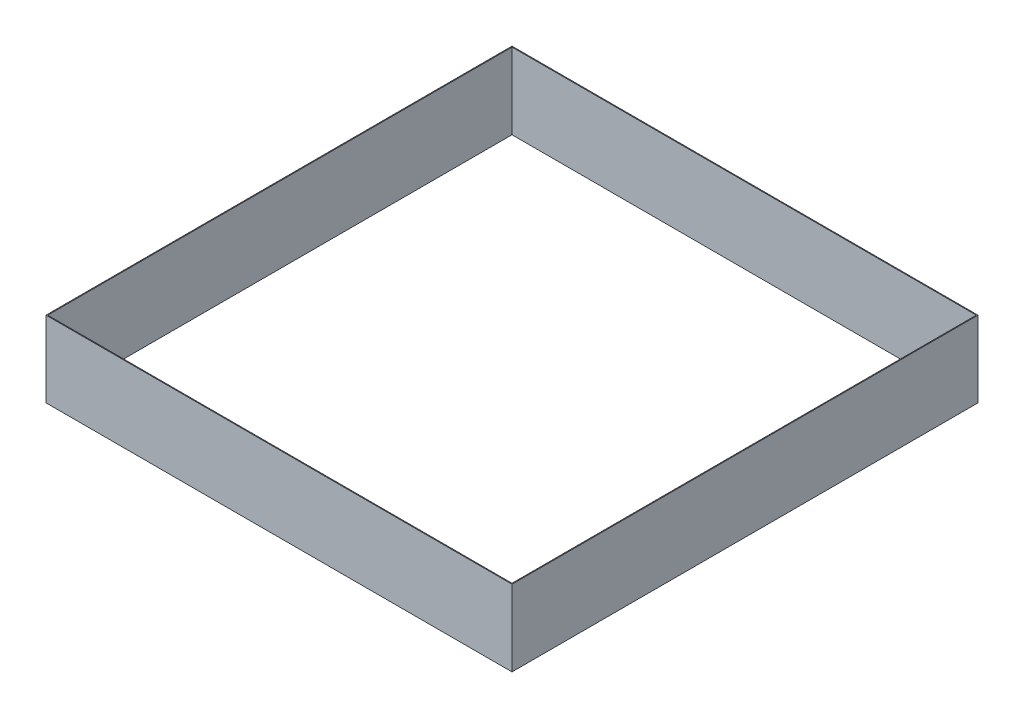
ISO-10303-21;
HEADER;
FILE_DESCRIPTION(('STEP AP214'),'2;1');
FILE_NAME('part.step','',(''),(''),'','','');
FILE_SCHEMA(('AUTOMOTIVE_DESIGN { 1 0 10303 214 1 1 1 1 }'));
ENDSEC;
DATA;
#1=APPLICATION_CONTEXT('core data for automotive mechanical design processes');
#2=APPLICATION_PROTOCOL_DEFINITION('international standard','automotive_design',2000,#1);
#3=PRODUCT_CONTEXT('',#1,'mechanical');
#4=PRODUCT('Part','Part','',(#3));
#5=PRODUCT_RELATED_PRODUCT_CATEGORY('part','',(#4));
#6=PRODUCT_DEFINITION_FORMATION('','',#4);
#7=PRODUCT_DEFINITION_CONTEXT('part definition',#1,'design');
#8=PRODUCT_DEFINITION('design','',#6,#7);
#9=PRODUCT_DEFINITION_SHAPE('','',#8);
#10=(LENGTH_UNIT() NAMED_UNIT(*) SI_UNIT(.MILLI.,.METRE.));
#11=(NAMED_UNIT(*) PLANE_ANGLE_UNIT() SI_UNIT($,.RADIAN.));
#12=(NAMED_UNIT(*) SI_UNIT($,.STERADIAN.) SOLID_ANGLE_UNIT());
#13=UNCERTAINTY_MEASURE_WITH_UNIT(LENGTH_MEASURE(1.E-05),#10,'distance_accuracy_value','');
#14=(GEOMETRIC_REPRESENTATION_CONTEXT(3) GLOBAL_UNCERTAINTY_ASSIGNED_CONTEXT((#13)) GLOBAL_UNIT_ASSIGNED_CONTEXT((#10,
#11,#12)) REPRESENTATION_CONTEXT('',''));
#15=CARTESIAN_POINT('',(0.,0.,0.));
#16=DIRECTION('',(0.,0.,1.));
#17=DIRECTION('',(1.,0.,0.));
#18=AXIS2_PLACEMENT_3D('',#15,#16,#17);
#19=CARTESIAN_POINT('',(0.,54.,0.));
#20=DIRECTION('',(0.,1.,0.));
#21=DIRECTION('',(0.,0.,1.));
#22=AXIS2_PLACEMENT_3D('',#19,#20,#21);
#23=PLANE('',#22);
#24=DIRECTION('',(-1.,0.,0.));
#25=VECTOR('',#24,1.);
#26=CARTESIAN_POINT('',(331.2,54.,0.));
#27=LINE('',#26,#25);
#28=CARTESIAN_POINT('',(331.2,54.,0.));
#29=VERTEX_POINT('',#28);
#30=CARTESIAN_POINT('',(0.,54.,0.));
#31=VERTEX_POINT('',#30);
#32=EDGE_CURVE('E153',#29,#31,#27,.T.);
#33=ORIENTED_EDGE('',*,*,#32,.T.);
#34=DIRECTION('',(0.,0.,1.));
#35=VECTOR('',#34,1.);
#36=CARTESIAN_POINT('',(0.,54.,0.));
#37=LINE('',#36,#35);
#38=CARTESIAN_POINT('',(0.,54.,331.2));
#39=VERTEX_POINT('',#38);
#40=EDGE_CURVE('E157',#31,#39,#37,.T.);
#41=ORIENTED_EDGE('',*,*,#40,.T.);
#42=DIRECTION('',(1.,0.,0.));
#43=VECTOR('',#42,1.);
#44=CARTESIAN_POINT('',(0.,54.,331.2));
#45=LINE('',#44,#43);
#46=CARTESIAN_POINT('',(331.2,54.,331.2));
#47=VERTEX_POINT('',#46);
#48=EDGE_CURVE('E161',#39,#47,#45,.T.);
#49=ORIENTED_EDGE('',*,*,#48,.T.);
#50=DIRECTION('',(0.,0.,-1.));
#51=VECTOR('',#50,1.);
#52=CARTESIAN_POINT('',(331.2,54.,331.2));
#53=LINE('',#52,#51);
#54=EDGE_CURVE('E164',#47,#29,#53,.T.);
#55=ORIENTED_EDGE('',*,*,#54,.T.);
#56=EDGE_LOOP('',(#33,#41,#49,#55));
#57=FACE_BOUND('',#56,.T.);
#58=DIRECTION('',(0.,0.,1.));
#59=VECTOR('',#58,1.);
#60=CARTESIAN_POINT('',(0.599999999999989,54.,0.600000000000043));
#61=LINE('',#60,#59);
#62=CARTESIAN_POINT('',(0.599999999999989,54.,0.600000000000043));
#63=VERTEX_POINT('',#62);
#64=CARTESIAN_POINT('',(0.60000000000004,54.,330.6));
#65=VERTEX_POINT('',#64);
#66=EDGE_CURVE('E114',#63,#65,#61,.T.);
#67=ORIENTED_EDGE('',*,*,#66,.F.);
#68=DIRECTION('',(-1.,0.,0.));
#69=VECTOR('',#68,1.);
#70=CARTESIAN_POINT('',(330.6,54.,0.600000000000003));
#71=LINE('',#70,#69);
#72=CARTESIAN_POINT('',(330.6,54.,0.600000000000003));
#73=VERTEX_POINT('',#72);
#74=EDGE_CURVE('E105',#73,#63,#71,.T.);
#75=ORIENTED_EDGE('',*,*,#74,.F.);
#76=DIRECTION('',(0.,0.,-1.));
#77=VECTOR('',#76,1.);
#78=CARTESIAN_POINT('',(330.6,54.,330.6));
#79=LINE('',#78,#77);
#80=CARTESIAN_POINT('',(330.6,54.,330.6));
#81=VERTEX_POINT('',#80);
#82=EDGE_CURVE('E131',#81,#73,#79,.T.);
#83=ORIENTED_EDGE('',*,*,#82,.F.);
#84=DIRECTION('',(1.,0.,0.));
#85=VECTOR('',#84,1.);
#86=CARTESIAN_POINT('',(0.60000000000004,54.,330.6));
#87=LINE('',#86,#85);
#88=EDGE_CURVE('E127',#65,#81,#87,.T.);
#89=ORIENTED_EDGE('',*,*,#88,.F.);
#90=EDGE_LOOP('',(#67,#75,#83,#89));
#91=FACE_BOUND('',#90,.T.);
#92=ADVANCED_FACE('F39',(#57,#91),#23,.T.);
#93=CARTESIAN_POINT('',(0.,0.,0.));
#94=DIRECTION('',(0.,1.,0.));
#95=DIRECTION('',(0.,0.,1.));
#96=AXIS2_PLACEMENT_3D('',#93,#94,#95);
#97=PLANE('',#96);
#98=DIRECTION('',(-1.,0.,0.));
#99=VECTOR('',#98,1.);
#100=CARTESIAN_POINT('',(331.2,0.,0.));
#101=LINE('',#100,#99);
#102=CARTESIAN_POINT('',(331.2,0.,0.));
#103=VERTEX_POINT('',#102);
#104=CARTESIAN_POINT('',(0.,0.,0.));
#105=VERTEX_POINT('',#104);
#106=EDGE_CURVE('E123',#103,#105,#101,.T.);
#107=ORIENTED_EDGE('',*,*,#106,.F.);
#108=DIRECTION('',(0.,0.,-1.));
#109=VECTOR('',#108,1.);
#110=CARTESIAN_POINT('',(331.2,0.,331.2));
#111=LINE('',#110,#109);
#112=CARTESIAN_POINT('',(331.2,0.,331.2));
#113=VERTEX_POINT('',#112);
#114=EDGE_CURVE('E158',#113,#103,#111,.T.);
#115=ORIENTED_EDGE('',*,*,#114,.F.);
#116=DIRECTION('',(1.,0.,0.));
#117=VECTOR('',#116,1.);
#118=CARTESIAN_POINT('',(0.,0.,331.2));
#119=LINE('',#118,#117);
#120=CARTESIAN_POINT('',(0.,0.,331.2));
#121=VERTEX_POINT('',#120);
#122=EDGE_CURVE('E174',#121,#113,#119,.T.);
#123=ORIENTED_EDGE('',*,*,#122,.F.);
#124=DIRECTION('',(0.,0.,1.));
#125=VECTOR('',#124,1.);
#126=CARTESIAN_POINT('',(0.,0.,0.));
#127=LINE('',#126,#125);
#128=EDGE_CURVE('E171',#105,#121,#127,.T.);
#129=ORIENTED_EDGE('',*,*,#128,.F.);
#130=EDGE_LOOP('',(#107,#115,#123,#129));
#131=FACE_BOUND('',#130,.T.);
#132=DIRECTION('',(-1.,0.,0.));
#133=VECTOR('',#132,1.);
#134=CARTESIAN_POINT('',(330.6,0.,0.600000000000003));
#135=LINE('',#134,#133);
#136=CARTESIAN_POINT('',(330.6,0.,0.600000000000003));
#137=VERTEX_POINT('',#136);
#138=CARTESIAN_POINT('',(0.599999999999989,0.,0.600000000000043));
#139=VERTEX_POINT('',#138);
#140=EDGE_CURVE('E63',#137,#139,#135,.T.);
#141=ORIENTED_EDGE('',*,*,#140,.T.);
#142=DIRECTION('',(0.,0.,1.));
#143=VECTOR('',#142,1.);
#144=CARTESIAN_POINT('',(0.599999999999989,0.,0.600000000000043));
#145=LINE('',#144,#143);
#146=CARTESIAN_POINT('',(0.60000000000004,0.,330.6));
#147=VERTEX_POINT('',#146);
#148=EDGE_CURVE('E121',#139,#147,#145,.T.);
#149=ORIENTED_EDGE('',*,*,#148,.T.);
#150=DIRECTION('',(1.,0.,0.));
#151=VECTOR('',#150,1.);
#152=CARTESIAN_POINT('',(0.60000000000004,0.,330.6));
#153=LINE('',#152,#151);
#154=CARTESIAN_POINT('',(330.6,0.,330.6));
#155=VERTEX_POINT('',#154);
#156=EDGE_CURVE('E140',#147,#155,#153,.T.);
#157=ORIENTED_EDGE('',*,*,#156,.T.);
#158=DIRECTION('',(0.,0.,-1.));
#159=VECTOR('',#158,1.);
#160=CARTESIAN_POINT('',(330.6,0.,330.6));
#161=LINE('',#160,#159);
#162=EDGE_CURVE('E115',#155,#137,#161,.T.);
#163=ORIENTED_EDGE('',*,*,#162,.T.);
#164=EDGE_LOOP('',(#141,#149,#157,#163));
#165=FACE_BOUND('',#164,.T.);
#166=ADVANCED_FACE('F197',(#131,#165),#97,.F.);
#167=CARTESIAN_POINT('',(331.2,54.,0.));
#168=DIRECTION('',(0.,0.,1.));
#169=DIRECTION('',(1.,0.,0.));
#170=AXIS2_PLACEMENT_3D('',#167,#168,#169);
#171=PLANE('',#170);
#172=ORIENTED_EDGE('',*,*,#106,.T.);
#173=DIRECTION('',(0.,-1.,0.));
#174=VECTOR('',#173,1.);
#175=CARTESIAN_POINT('',(0.,54.,0.));
#176=LINE('',#175,#174);
#177=EDGE_CURVE('E11',#31,#105,#176,.T.);
#178=ORIENTED_EDGE('',*,*,#177,.F.);
#179=ORIENTED_EDGE('',*,*,#32,.F.);
#180=DIRECTION('',(0.,-1.,0.));
#181=VECTOR('',#180,1.);
#182=CARTESIAN_POINT('',(331.2,54.,0.));
#183=LINE('',#182,#181);
#184=EDGE_CURVE('E167',#29,#103,#183,.T.);
#185=ORIENTED_EDGE('',*,*,#184,.T.);
#186=EDGE_LOOP('',(#172,#178,#179,#185));
#187=FACE_BOUND('',#186,.T.);
#188=ADVANCED_FACE('F41',(#187),#171,.F.);
#189=CARTESIAN_POINT('',(0.,54.,0.));
#190=DIRECTION('',(1.,0.,0.));
#191=DIRECTION('',(0.,0.,-1.));
#192=AXIS2_PLACEMENT_3D('',#189,#190,#191);
#193=PLANE('',#192);
#194=ORIENTED_EDGE('',*,*,#128,.T.);
#195=DIRECTION('',(0.,-1.,0.));
#196=VECTOR('',#195,1.);
#197=CARTESIAN_POINT('',(0.,54.,331.2));
#198=LINE('',#197,#196);
#199=EDGE_CURVE('E48',#39,#121,#198,.T.);
#200=ORIENTED_EDGE('',*,*,#199,.F.);
#201=ORIENTED_EDGE('',*,*,#40,.F.);
#202=ORIENTED_EDGE('',*,*,#177,.T.);
#203=EDGE_LOOP('',(#194,#200,#201,#202));
#204=FACE_BOUND('',#203,.T.);
#205=ADVANCED_FACE('F207',(#204),#193,.F.);
#206=CARTESIAN_POINT('',(0.,54.,331.2));
#207=DIRECTION('',(0.,0.,-1.));
#208=DIRECTION('',(-1.,0.,0.));
#209=AXIS2_PLACEMENT_3D('',#206,#207,#208);
#210=PLANE('',#209);
#211=ORIENTED_EDGE('',*,*,#122,.T.);
#212=DIRECTION('',(0.,-1.,0.));
#213=VECTOR('',#212,1.);
#214=CARTESIAN_POINT('',(331.2,54.,331.2));
#215=LINE('',#214,#213);
#216=EDGE_CURVE('E182',#47,#113,#215,.T.);
#217=ORIENTED_EDGE('',*,*,#216,.F.);
#218=ORIENTED_EDGE('',*,*,#48,.F.);
#219=ORIENTED_EDGE('',*,*,#199,.T.);
#220=EDGE_LOOP('',(#211,#217,#218,#219));
#221=FACE_BOUND('',#220,.T.);
#222=ADVANCED_FACE('F191',(#221),#210,.F.);
#223=CARTESIAN_POINT('',(331.2,54.,331.2));
#224=DIRECTION('',(-1.,0.,0.));
#225=DIRECTION('',(0.,0.,1.));
#226=AXIS2_PLACEMENT_3D('',#223,#224,#225);
#227=PLANE('',#226);
#228=ORIENTED_EDGE('',*,*,#114,.T.);
#229=ORIENTED_EDGE('',*,*,#184,.F.);
#230=ORIENTED_EDGE('',*,*,#54,.F.);
#231=ORIENTED_EDGE('',*,*,#216,.T.);
#232=EDGE_LOOP('',(#228,#229,#230,#231));
#233=FACE_BOUND('',#232,.T.);
#234=ADVANCED_FACE('F201',(#233),#227,.F.);
#235=CARTESIAN_POINT('',(330.6,54.,0.600000000000003));
#236=DIRECTION('',(0.,0.,1.));
#237=DIRECTION('',(1.,0.,0.));
#238=AXIS2_PLACEMENT_3D('',#235,#236,#237);
#239=PLANE('',#238);
#240=ORIENTED_EDGE('',*,*,#140,.F.);
#241=DIRECTION('',(0.,-1.,0.));
#242=VECTOR('',#241,1.);
#243=CARTESIAN_POINT('',(330.6,54.,0.600000000000003));
#244=LINE('',#243,#242);
#245=EDGE_CURVE('E109',#73,#137,#244,.T.);
#246=ORIENTED_EDGE('',*,*,#245,.F.);
#247=ORIENTED_EDGE('',*,*,#74,.T.);
#248=DIRECTION('',(0.,-1.,0.));
#249=VECTOR('',#248,1.);
#250=CARTESIAN_POINT('',(0.599999999999989,54.,0.600000000000043));
#251=LINE('',#250,#249);
#252=EDGE_CURVE('E108',#63,#139,#251,.T.);
#253=ORIENTED_EDGE('',*,*,#252,.T.);
#254=EDGE_LOOP('',(#240,#246,#247,#253));
#255=FACE_BOUND('',#254,.T.);
#256=ADVANCED_FACE('F107',(#255),#239,.T.);
#257=CARTESIAN_POINT('',(0.599999999999989,54.,0.600000000000043));
#258=DIRECTION('',(1.,0.,0.));
#259=DIRECTION('',(0.,0.,-1.));
#260=AXIS2_PLACEMENT_3D('',#257,#258,#259);
#261=PLANE('',#260);
#262=ORIENTED_EDGE('',*,*,#148,.F.);
#263=ORIENTED_EDGE('',*,*,#252,.F.);
#264=ORIENTED_EDGE('',*,*,#66,.T.);
#265=DIRECTION('',(0.,-1.,0.));
#266=VECTOR('',#265,1.);
#267=CARTESIAN_POINT('',(0.60000000000004,54.,330.6));
#268=LINE('',#267,#266);
#269=EDGE_CURVE('E124',#65,#147,#268,.T.);
#270=ORIENTED_EDGE('',*,*,#269,.T.);
#271=EDGE_LOOP('',(#262,#263,#264,#270));
#272=FACE_BOUND('',#271,.T.);
#273=ADVANCED_FACE('F118',(#272),#261,.T.);
#274=CARTESIAN_POINT('',(0.60000000000004,54.,330.6));
#275=DIRECTION('',(0.,0.,-1.));
#276=DIRECTION('',(-1.,0.,0.));
#277=AXIS2_PLACEMENT_3D('',#274,#275,#276);
#278=PLANE('',#277);
#279=ORIENTED_EDGE('',*,*,#156,.F.);
#280=ORIENTED_EDGE('',*,*,#269,.F.);
#281=ORIENTED_EDGE('',*,*,#88,.T.);
#282=DIRECTION('',(0.,-1.,0.));
#283=VECTOR('',#282,1.);
#284=CARTESIAN_POINT('',(330.6,54.,330.6));
#285=LINE('',#284,#283);
#286=EDGE_CURVE('E55',#81,#155,#285,.T.);
#287=ORIENTED_EDGE('',*,*,#286,.T.);
#288=EDGE_LOOP('',(#279,#280,#281,#287));
#289=FACE_BOUND('',#288,.T.);
#290=ADVANCED_FACE('F230',(#289),#278,.T.);
#291=CARTESIAN_POINT('',(330.6,54.,330.6));
#292=DIRECTION('',(-1.,0.,0.));
#293=DIRECTION('',(0.,0.,1.));
#294=AXIS2_PLACEMENT_3D('',#291,#292,#293);
#295=PLANE('',#294);
#296=ORIENTED_EDGE('',*,*,#162,.F.);
#297=ORIENTED_EDGE('',*,*,#286,.F.);
#298=ORIENTED_EDGE('',*,*,#82,.T.);
#299=ORIENTED_EDGE('',*,*,#245,.T.);
#300=EDGE_LOOP('',(#296,#297,#298,#299));
#301=FACE_BOUND('',#300,.T.);
#302=ADVANCED_FACE('F234',(#301),#295,.T.);
#303=CLOSED_SHELL('',(#92,#166,#188,#205,#222,#234,#256,#273,#290,#302));
#304=MANIFOLD_SOLID_BREP('B2',#303);
#305=ADVANCED_BREP_SHAPE_REPRESENTATION('',(#18,#304),#14);
#306=SHAPE_DEFINITION_REPRESENTATION(#9,#305);
ENDSEC;
END-ISO-10303-21;
